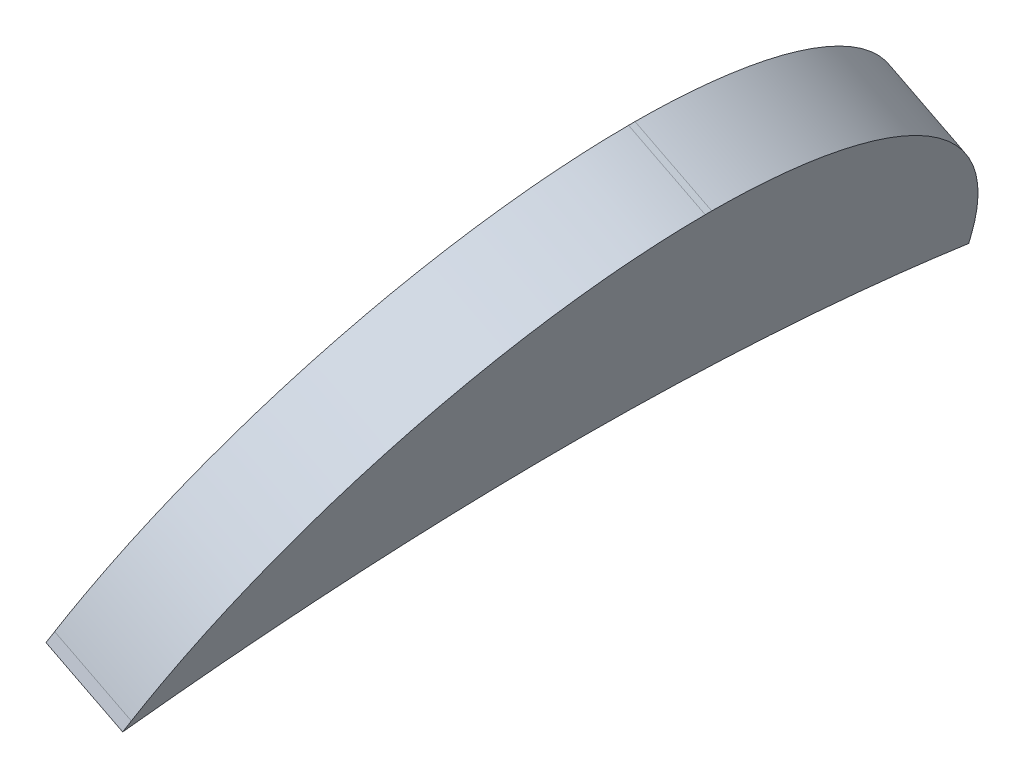
ISO-10303-21;
HEADER;
FILE_DESCRIPTION(('STEP AP214'),'2;1');
FILE_NAME('part.step','',(''),(''),'','','');
FILE_SCHEMA(('AUTOMOTIVE_DESIGN { 1 0 10303 214 1 1 1 1 }'));
ENDSEC;
DATA;
#1=APPLICATION_CONTEXT('core data for automotive mechanical design processes');
#2=APPLICATION_PROTOCOL_DEFINITION('international standard','automotive_design',2000,#1);
#3=PRODUCT_CONTEXT('',#1,'mechanical');
#4=PRODUCT('Part','Part','',(#3));
#5=PRODUCT_RELATED_PRODUCT_CATEGORY('part','',(#4));
#6=PRODUCT_DEFINITION_FORMATION('','',#4);
#7=PRODUCT_DEFINITION_CONTEXT('part definition',#1,'design');
#8=PRODUCT_DEFINITION('design','',#6,#7);
#9=PRODUCT_DEFINITION_SHAPE('','',#8);
#10=(LENGTH_UNIT() NAMED_UNIT(*) SI_UNIT(.MILLI.,.METRE.));
#11=(NAMED_UNIT(*) PLANE_ANGLE_UNIT() SI_UNIT($,.RADIAN.));
#12=(NAMED_UNIT(*) SI_UNIT($,.STERADIAN.) SOLID_ANGLE_UNIT());
#13=UNCERTAINTY_MEASURE_WITH_UNIT(LENGTH_MEASURE(1.E-05),#10,'distance_accuracy_value','');
#14=(GEOMETRIC_REPRESENTATION_CONTEXT(3) GLOBAL_UNCERTAINTY_ASSIGNED_CONTEXT((#13)) GLOBAL_UNIT_ASSIGNED_CONTEXT((#10,
#11,#12)) REPRESENTATION_CONTEXT('',''));
#15=CARTESIAN_POINT('',(0.,0.,0.));
#16=DIRECTION('',(0.,0.,1.));
#17=DIRECTION('',(1.,0.,0.));
#18=AXIS2_PLACEMENT_3D('',#15,#16,#17);
#19=CARTESIAN_POINT('',(35.2490884192573,12.9103957627904,-9.7549712300063));
#20=CARTESIAN_POINT('',(35.6192108039737,13.6368018433572,-9.5305018694734));
#21=CARTESIAN_POINT('',(35.968515207691,14.3223503357121,-9.19999755040302));
#22=CARTESIAN_POINT('',(36.3240511950212,15.0201289995315,-8.86359704085593));
#23=CARTESIAN_POINT('',(36.6500430439071,15.6599240268638,-8.42450539766577));
#24=CARTESIAN_POINT('',(36.9802362693852,16.3079647200339,-7.97975474993949));
#25=CARTESIAN_POINT('',(37.2722134976287,16.8810022955527,-7.43975909790062));
#26=CARTESIAN_POINT('',(37.5696349216576,17.4647247069142,-6.88969470841019));
#27=CARTESIAN_POINT('',(37.8199763918945,17.9560475063647,-6.25391612182486));
#28=CARTESIAN_POINT('',(38.0737529021154,18.4541119513747,-5.60941375142613));
#29=CARTESIAN_POINT('',(38.2725574032638,18.8442877538702,-4.89279397868525));
#30=CARTESIAN_POINT('',(38.4750773397058,19.2417555087055,-4.16278137841586));
#31=CARTESIAN_POINT('',(38.6150354312108,19.5164387294235,-3.37681221377558));
#32=CARTESIAN_POINT('',(38.7557841559375,19.7926736552085,-2.58640305337568));
#33=CARTESIAN_POINT('',(38.8292609954785,19.936880072403,-1.76032012357194));
#34=CARTESIAN_POINT('',(38.9036011901101,20.0827809193683,-0.924530694316677));
#35=CARTESIAN_POINT('',(38.9067912024292,20.0890416710583,-0.0755121780838611));
#36=B_SPLINE_CURVE_WITH_KNOTS('',2,(#19,#20,#21,#22,#23,#24,#25,#26,#27,#28,#29,#30,#31,#32,#33,
#34,#35),.UNSPECIFIED.,.F.,.F.,(3,2,2,2,2,2,2,2,3),(0.,0.125,0.25,0.375,0.5,0.625,0.75,0.875,
1.),.UNSPECIFIED.);
#37=DIRECTION('',(0.891006524188365,-0.453990499739552,0.));
#38=VECTOR('',#37,1.);
#39=SURFACE_OF_LINEAR_EXTRUSION('',#36,#38);
#40=CARTESIAN_POINT('',(54.0564950248638,3.32754345824409,-9.75497123000664));
#41=CARTESIAN_POINT('',(54.113171539568,3.43877738141789,-9.72059922411126));
#42=CARTESIAN_POINT('',(54.1696021043751,3.54952860073974,-9.68428725544756));
#43=CARTESIAN_POINT('',(54.2819177822345,3.76996053003947,-9.6077751760437));
#44=CARTESIAN_POINT('',(54.3378028902302,3.87964123009328,-9.56757502929647));
#45=CARTESIAN_POINT('',(54.5046491742697,4.2070954999536,-9.4410619710578));
#46=CARTESIAN_POINT('',(54.6147083005214,4.423098697362,-9.34889270930641));
#47=CARTESIAN_POINT('',(54.8319535294718,4.8494664659708,-9.14920445576849));
#48=CARTESIAN_POINT('',(54.9391386929741,5.05982919389474,-9.04168051705134));
#49=CARTESIAN_POINT('',(55.1505691576477,5.47478484504697,-8.81080109391559));
#50=CARTESIAN_POINT('',(55.2547983123668,5.67934607907867,-8.6873737214906));
#51=CARTESIAN_POINT('',(55.4592497178855,6.08060455541496,-8.42550347894755));
#52=CARTESIAN_POINT('',(55.559473237772,6.27730428844296,-8.28706541704522));
#53=CARTESIAN_POINT('',(55.7553530003226,6.66173996824062,-7.99537684574409));
#54=CARTESIAN_POINT('',(55.8510103824776,6.84947815138724,-7.8421300610758));
#55=CARTESIAN_POINT('',(56.0039898786009,7.1497173176057,-7.57852110438533));
#56=CARTESIAN_POINT('',(56.0628138250735,7.26516581292804,-7.47236344155542));
#57=CARTESIAN_POINT('',(56.17820391954,7.49163162455931,-7.25426089740207));
#58=CARTESIAN_POINT('',(56.2347699937709,7.60264879609988,-7.14231582728172));
#59=CARTESIAN_POINT('',(56.4008148868774,7.92853024769625,-6.79790754003357));
#60=CARTESIAN_POINT('',(56.5066756113853,8.13629361773587,-6.55681076670275));
#61=CARTESIAN_POINT('',(56.6571101813456,8.43153808513108,-6.17974108802468));
#62=CARTESIAN_POINT('',(56.7058153115994,8.52712728543916,-6.05162364496533));
#63=CARTESIAN_POINT('',(56.8003376943235,8.71263790677901,-5.79031072908529));
#64=CARTESIAN_POINT('',(56.8461552039565,8.80255983252068,-5.65711571015807));
#65=CARTESIAN_POINT('',(56.9347233024221,8.97638451302189,-5.38592850207537));
#66=CARTESIAN_POINT('',(56.977474740615,9.06028893474473,-5.24793765730306));
#67=CARTESIAN_POINT('',(57.059815286491,9.22189135511013,-4.9673813606735));
#68=CARTESIAN_POINT('',(57.0994033420332,9.29958728880962,-4.82481440871994));
#69=CARTESIAN_POINT('',(57.1709271324837,9.43996063134129,-4.55191007556448));
#70=CARTESIAN_POINT('',(57.2032210032108,9.50334092129381,-4.42202750516254));
#71=CARTESIAN_POINT('',(57.2650789320465,9.62474394227561,-4.15912885531162));
#72=CARTESIAN_POINT('',(57.29464276552,9.68276623243366,-4.02611251913585));
#73=CARTESIAN_POINT('',(57.3509426752869,9.79326102680122,-3.75723709382679));
#74=CARTESIAN_POINT('',(57.3776792689517,9.84573454640917,-3.62137853027706));
#75=CARTESIAN_POINT('',(57.4282687911758,9.94502207419455,-3.3470784105811));
#76=CARTESIAN_POINT('',(57.4521216935917,9.99183603106281,-3.20863683103056));
#77=CARTESIAN_POINT('',(57.4968147500151,10.0795510931226,-2.92960011925847));
#78=CARTESIAN_POINT('',(57.5176585111688,10.1204592777371,-2.78900779270161));
#79=CARTESIAN_POINT('',(57.5562831369796,10.1962643741245,-2.50581399646791));
#80=CARTESIAN_POINT('',(57.5740643586675,10.23116198661,-2.36321276308915));
#81=CARTESIAN_POINT('',(57.6065046657975,10.2948296741851,-2.07637377664296));
#82=CARTESIAN_POINT('',(57.6211653635472,10.3236029136066,-1.93213690944804));
#83=CARTESIAN_POINT('',(57.6473478910575,10.3749890171591,-1.64229529294415));
#84=CARTESIAN_POINT('',(57.6588697086321,10.3976018573736,-1.49669053832689));
#85=CARTESIAN_POINT('',(57.683113673492,10.4451833175027,-1.13937774720138));
#86=CARTESIAN_POINT('',(57.6940900173651,10.4667256053001,-0.927075509946327));
#87=CARTESIAN_POINT('',(57.7054455272007,10.4890120481987,-0.607979798457037));
#88=CARTESIAN_POINT('',(57.7083788831611,10.4947690834231,-0.501593783152101));
#89=CARTESIAN_POINT('',(57.7125551969867,10.5029655608115,-0.28865115558959));
#90=CARTESIAN_POINT('',(57.7137980018287,10.5054047026506,-0.182094528762694));
#91=CARTESIAN_POINT('',(57.7141978080355,10.5061893665121,-0.0755121780841964));
#92=B_SPLINE_CURVE_WITH_KNOTS('',3,(#40,#41,#42,#43,#44,#45,#46,#47,#48,#49,#50,#51,#52,#53,#54,
#55,#56,#57,#58,#59,#60,#61,#62,#63,#64,#65,#66,#67,#68,#69,#70,#71,#72,#73,#74,#75,#76,#77,#78,
#79,#80,#81,#82,#83,#84,#85,#86,#87,#88,#89,#90,#91),.UNSPECIFIED.,.F.,.F.,(4,2,2,2,2,2,2,2,2,2,
2,2,2,2,2,2,2,2,2,2,2,2,2,2,2,4),(0.,0.388427147838391,0.776857893110456,1.55435559830047,
2.33210436323393,3.11350093590628,3.89464794738185,4.67559899150483,5.17794821526701,
5.68031383702904,6.68475097764644,7.18591367029899,7.68703166770575,8.18801030534154,
8.68915488086065,9.1332634737134,9.57740857656615,10.0214722618244,10.465539972628,
10.9090708658734,11.3525500172282,11.7957994732294,12.2390506500366,12.8794674228852,
13.199159228906,13.518879970467),.UNSPECIFIED.);
#93=CARTESIAN_POINT('',(54.0564950248638,3.32754345824409,-9.75497123000664));
#94=VERTEX_POINT('',#93);
#95=CARTESIAN_POINT('',(57.7141978080355,10.5061893665121,-0.0755121780841964));
#96=VERTEX_POINT('',#95);
#97=EDGE_CURVE('E218',#94,#96,#92,.T.);
#98=ORIENTED_EDGE('',*,*,#97,.T.);
#99=DIRECTION('',(0.891006524188365,-0.453990499739552,0.));
#100=VECTOR('',#99,1.);
#101=CARTESIAN_POINT('',(58.6052043322236,10.0521988667722,-0.0755121780842122));
#102=LINE('',#101,#100);
#103=CARTESIAN_POINT('',(59.4962108564122,9.59820836703303,-0.0755121780842281));
#104=VERTEX_POINT('',#103);
#105=EDGE_CURVE('E11',#104,#96,#102,.F.);
#106=ORIENTED_EDGE('',*,*,#105,.F.);
#107=CARTESIAN_POINT('',(55.8385080732406,2.41956245876498,-9.75497123000667));
#108=CARTESIAN_POINT('',(55.8951845879448,2.53079638193878,-9.72059922411129));
#109=CARTESIAN_POINT('',(55.9516151527518,2.64154760126064,-9.68428725544759));
#110=CARTESIAN_POINT('',(56.0639308306112,2.86197953056037,-9.60777517604373));
#111=CARTESIAN_POINT('',(56.119815938607,2.97166023061418,-9.5675750292965));
#112=CARTESIAN_POINT('',(56.2866622226464,3.2991145004745,-9.44106197105784));
#113=CARTESIAN_POINT('',(56.3967213488981,3.5151176978829,-9.34889270930644));
#114=CARTESIAN_POINT('',(56.6139665778485,3.9414854664917,-9.14920445576852));
#115=CARTESIAN_POINT('',(56.7211517413508,4.15184819441564,-9.04168051705137));
#116=CARTESIAN_POINT('',(56.9325822060244,4.56680384556786,-8.81080109391562));
#117=CARTESIAN_POINT('',(57.0368113607435,4.77136507959957,-8.68737372149063));
#118=CARTESIAN_POINT('',(57.2412627662622,5.17262355593586,-8.42550347894758));
#119=CARTESIAN_POINT('',(57.3414862861487,5.36932328896386,-8.28706541704525));
#120=CARTESIAN_POINT('',(57.5373660486993,5.75375896876151,-7.99537684574412));
#121=CARTESIAN_POINT('',(57.6330234308544,5.94149715190814,-7.84213006107582));
#122=CARTESIAN_POINT('',(57.7860029269777,6.24173631812659,-7.57852110438536));
#123=CARTESIAN_POINT('',(57.8448268734502,6.35718481344894,-7.47236344155545));
#124=CARTESIAN_POINT('',(57.9602169679168,6.5836506250802,-7.25426089740211));
#125=CARTESIAN_POINT('',(58.0167830421476,6.69466779662077,-7.14231582728175));
#126=CARTESIAN_POINT('',(58.1828279352541,7.02054924821714,-6.7979075400336));
#127=CARTESIAN_POINT('',(58.288688659762,7.22831261825676,-6.55681076670278));
#128=CARTESIAN_POINT('',(58.4391232297223,7.52355708565198,-6.17974108802472));
#129=CARTESIAN_POINT('',(58.4878283599761,7.61914628596005,-6.05162364496537));
#130=CARTESIAN_POINT('',(58.5823507427003,7.8046569072999,-5.79031072908534));
#131=CARTESIAN_POINT('',(58.6281682523332,7.89457883304157,-5.65711571015811));
#132=CARTESIAN_POINT('',(58.7167363507988,8.06840351354278,-5.38592850207541));
#133=CARTESIAN_POINT('',(58.7594877889917,8.15230793526562,-5.24793765730311));
#134=CARTESIAN_POINT('',(58.8418283348678,8.31391035563101,-4.96738136067354));
#135=CARTESIAN_POINT('',(58.8814163904099,8.39160628933051,-4.82481440871999));
#136=CARTESIAN_POINT('',(58.9529401808604,8.53197963186218,-4.55191007556453));
#137=CARTESIAN_POINT('',(58.9852340515875,8.5953599218147,-4.42202750516259));
#138=CARTESIAN_POINT('',(59.0470919804233,8.7167629427965,-4.15912885531167));
#139=CARTESIAN_POINT('',(59.0766558138967,8.77478523295455,-4.02611251913591));
#140=CARTESIAN_POINT('',(59.1329557236637,8.88528002732211,-3.75723709382685));
#141=CARTESIAN_POINT('',(59.1596923173285,8.93775354693006,-3.62137853027712));
#142=CARTESIAN_POINT('',(59.2102818395525,9.03704107471543,-3.34707841058115));
#143=CARTESIAN_POINT('',(59.2341347419684,9.08385503158369,-3.20863683103062));
#144=CARTESIAN_POINT('',(59.2788277983918,9.17157009364347,-2.92960011925853));
#145=CARTESIAN_POINT('',(59.2996715595456,9.212478278258,-2.78900779270167));
#146=CARTESIAN_POINT('',(59.3382961853563,9.28828337464538,-2.50581399646797));
#147=CARTESIAN_POINT('',(59.3560774070442,9.32318098713085,-2.36321276308922));
#148=CARTESIAN_POINT('',(59.3885177141743,9.38684867470603,-2.07637377664302));
#149=CARTESIAN_POINT('',(59.4031784119239,9.4156219141275,-1.9321369094481));
#150=CARTESIAN_POINT('',(59.4293609394343,9.46700801768,-1.64229529294421));
#151=CARTESIAN_POINT('',(59.4408827570089,9.48962085789447,-1.49669053832696));
#152=CARTESIAN_POINT('',(59.4651267218688,9.53720231802359,-1.13937774720145));
#153=CARTESIAN_POINT('',(59.4761030657419,9.558744605821,-0.927075509946384));
#154=CARTESIAN_POINT('',(59.4874585755774,9.58103104871961,-0.607979798457085));
#155=CARTESIAN_POINT('',(59.4903919315379,9.58678808394395,-0.501593783152147));
#156=CARTESIAN_POINT('',(59.4945682453635,9.59498456133235,-0.288651155589629));
#157=CARTESIAN_POINT('',(59.4958110502054,9.59742370317145,-0.182094528762729));
#158=CARTESIAN_POINT('',(59.4962108564122,9.59820836703303,-0.0755121780842281));
#159=B_SPLINE_CURVE_WITH_KNOTS('',3,(#107,#108,#109,#110,#111,#112,#113,#114,#115,#116,#117,
#118,#119,#120,#121,#122,#123,#124,#125,#126,#127,#128,#129,#130,#131,#132,#133,#134,#135,#136,
#137,#138,#139,#140,#141,#142,#143,#144,#145,#146,#147,#148,#149,#150,#151,#152,#153,#154,#155,
#156,#157,#158),.UNSPECIFIED.,.F.,.F.,(4,2,2,2,2,2,2,2,2,2,2,2,2,2,2,2,2,2,2,2,2,2,2,2,2,4),(0.,
0.388427147838392,0.776857893110461,1.55435559830048,2.33210436323393,3.11350093590628,
3.89464794738185,4.67559899150483,5.17794821526701,5.68031383702903,6.68475097764643,
7.18591367029898,7.68703166770574,8.18801030534153,8.68915488086064,9.13326347371338,
9.57740857656613,10.0214722618244,10.4655399726279,10.9090708658734,11.3525500172281,
11.7957994732293,12.2390506500365,12.8794674228851,13.199159228906,13.518879970467),.UNSPECIFIED.);
#160=CARTESIAN_POINT('',(55.8385080732406,2.41956245876498,-9.75497123000667));
#161=VERTEX_POINT('',#160);
#162=EDGE_CURVE('E205',#161,#104,#159,.T.);
#163=ORIENTED_EDGE('',*,*,#162,.F.);
#164=DIRECTION('',(0.891006524188365,-0.453990499739552,0.));
#165=VECTOR('',#164,1.);
#166=CARTESIAN_POINT('',(54.9475015490522,2.87355295850454,-9.75497123000665));
#167=LINE('',#166,#165);
#168=EDGE_CURVE('E212',#161,#94,#167,.F.);
#169=ORIENTED_EDGE('',*,*,#168,.T.);
#170=EDGE_LOOP('',(#98,#106,#163,#169));
#171=FACE_BOUND('',#170,.T.);
#172=ADVANCED_FACE('F42',(#171),#39,.T.);
#173=CARTESIAN_POINT('',(59.4962108564124,9.59820836703334,0.0755121780439684));
#174=DIRECTION('',(-0.453990499739548,-0.891006524188367,-7.39999391529568E-13));
#175=DIRECTION('',(0.891006524188367,-0.453990499739548,0.));
#176=AXIS2_PLACEMENT_3D('',#173,#174,#175);
#177=PLANE('',#176);
#178=DIRECTION('',(-3.67564230415252E-13,-6.43237403226691E-13,1.));
#179=VECTOR('',#178,1.);
#180=CARTESIAN_POINT('',(57.7141978080356,10.5061893665124,0.0755121780439684));
#181=LINE('',#180,#179);
#182=CARTESIAN_POINT('',(57.7141978080356,10.5061893665124,0.0755121780439684));
#183=VERTEX_POINT('',#182);
#184=EDGE_CURVE('E228',#96,#183,#181,.T.);
#185=ORIENTED_EDGE('',*,*,#184,.T.);
#186=DIRECTION('',(0.891006524188365,-0.453990499739552,0.));
#187=VECTOR('',#186,1.);
#188=CARTESIAN_POINT('',(58.605204332224,10.0521988667729,0.0755121780439525));
#189=LINE('',#188,#187);
#190=CARTESIAN_POINT('',(59.4962108564123,9.59820836703333,0.0755121780439366));
#191=VERTEX_POINT('',#190);
#192=EDGE_CURVE('E53',#191,#183,#189,.F.);
#193=ORIENTED_EDGE('',*,*,#192,.F.);
#194=DIRECTION('',(-3.67564230415252E-13,-6.43237403226691E-13,1.));
#195=VECTOR('',#194,1.);
#196=CARTESIAN_POINT('',(59.4962108564124,9.59820836703334,0.0755121780439684));
#197=LINE('',#196,#195);
#198=EDGE_CURVE('E74',#104,#191,#197,.T.);
#199=ORIENTED_EDGE('',*,*,#198,.F.);
#200=ORIENTED_EDGE('',*,*,#105,.T.);
#201=EDGE_LOOP('',(#185,#193,#199,#200));
#202=FACE_BOUND('',#201,.T.);
#203=ADVANCED_FACE('F170',(#202),#177,.F.);
#204=CARTESIAN_POINT('',(38.9067912024293,20.0890416710586,0.0755121780443037));
#205=CARTESIAN_POINT('',(38.9036192115726,20.0828162884799,0.919734300937986));
#206=CARTESIAN_POINT('',(38.8299997944435,19.9383300470131,1.75199111754715));
#207=CARTESIAN_POINT('',(38.7564282155278,19.7939376933265,2.58370713010286));
#208=CARTESIAN_POINT('',(38.6142343024536,19.5148664257082,3.38130855209937));
#209=CARTESIAN_POINT('',(38.4753811225035,19.2423517160153,4.16017096176636));
#210=CARTESIAN_POINT('',(38.2744755688813,18.8480523658621,4.88587247973147));
#211=CARTESIAN_POINT('',(38.0751348200923,18.4568241181135,5.60592168384942));
#212=CARTESIAN_POINT('',(37.8196088339715,17.9553261333231,6.25484957597894));
#213=CARTESIAN_POINT('',(37.3225581169416,16.9798091743113,7.51714809590748));
#214=CARTESIAN_POINT('',(36.6529735774407,15.6656755227631,8.42055482266221));
#215=CARTESIAN_POINT('',(36.0026747028792,14.3893921198305,9.29794123621033));
#216=CARTESIAN_POINT('',(35.2490884192576,12.9103957627902,9.75497123000699));
#217=B_SPLINE_CURVE_WITH_KNOTS('',2,(#204,#205,#206,#207,#208,#209,#210,#211,#212,#213,#214,
#215,#216),.UNSPECIFIED.,.F.,.F.,(3,2,2,2,2,2,3),(0.,0.125,0.25,0.375,0.5,0.75,1.),.UNSPECIFIED.);
#218=DIRECTION('',(0.891006524188365,-0.453990499739552,0.));
#219=VECTOR('',#218,1.);
#220=SURFACE_OF_LINEAR_EXTRUSION('',#217,#219);
#221=CARTESIAN_POINT('',(57.7141978080356,10.5061893665124,0.0755121780439684));
#222=CARTESIAN_POINT('',(57.7137056519681,10.5052234558439,0.207414793511595));
#223=CARTESIAN_POINT('',(57.7119162154395,10.501711488914,0.339293128886856));
#224=CARTESIAN_POINT('',(57.7057455908609,10.4896009562904,0.602750121327787));
#225=CARTESIAN_POINT('',(57.7013645029979,10.4810025872252,0.734328789780503));
#226=CARTESIAN_POINT('',(57.6900148748831,10.4587276878533,0.996910209753328));
#227=CARTESIAN_POINT('',(57.6830470316434,10.4450525255105,1.12791310680473));
#228=CARTESIAN_POINT('',(57.6665520689436,10.4126793384279,1.38912589748981));
#229=CARTESIAN_POINT('',(57.6570249195524,10.3939812549453,1.51933578183101));
#230=CARTESIAN_POINT('',(57.6247397113713,10.3306179661966,1.90760852707728));
#231=CARTESIAN_POINT('',(57.5982385452672,10.2786064991925,2.16421425048234));
#232=CARTESIAN_POINT('',(57.5354290288163,10.1553358823603,2.67149805237717));
#233=CARTESIAN_POINT('',(57.4991202743034,10.0840759393115,2.92217588611828));
#234=CARTESIAN_POINT('',(57.4172211543711,9.92333986614056,3.41587370062559));
#235=CARTESIAN_POINT('',(57.3716369388627,9.83387580589868,3.65889863284413));
#236=CARTESIAN_POINT('',(57.2715679834817,9.63747942279296,4.13587200501085));
#237=CARTESIAN_POINT('',(57.2170834064128,9.53054741944958,4.36982061088469));
#238=CARTESIAN_POINT('',(57.0998023339911,9.30037035461766,4.82741143836911));
#239=CARTESIAN_POINT('',(57.0370043395819,9.17712235106557,5.05105179139092));
#240=CARTESIAN_POINT('',(56.9036320293902,8.91536445393979,5.48682721981157));
#241=CARTESIAN_POINT('',(56.8330572173154,8.77685358633779,5.69896155964198));
#242=CARTESIAN_POINT('',(56.7200287057269,8.55502264207267,6.01270928873766));
#243=CARTESIAN_POINT('',(56.6801642915292,8.47678432397242,6.11890265878426));
#244=CARTESIAN_POINT('',(56.5985799203972,8.3166659801037,6.32778375411513));
#245=CARTESIAN_POINT('',(56.5568599320403,8.23478589266492,6.43047141998114));
#246=CARTESIAN_POINT('',(56.4716503630498,8.06755269739452,6.6322143075975));
#247=CARTESIAN_POINT('',(56.4281608465897,7.98219971551053,6.73126966082969));
#248=CARTESIAN_POINT('',(56.339476972163,7.80814781189183,6.92558939019138));
#249=CARTESIAN_POINT('',(56.2942826328846,7.71944892683462,7.02085380785329));
#250=CARTESIAN_POINT('',(56.1561254568633,7.44830020176433,7.30103994005702));
#251=CARTESIAN_POINT('',(56.0606866600148,7.26099101643664,7.480122184798));
#252=CARTESIAN_POINT('',(55.9131799195169,6.97149273790265,7.73645780879292));
#253=CARTESIAN_POINT('',(55.8632794256678,6.87355750444449,7.81986518199033));
#254=CARTESIAN_POINT('',(55.7621114092642,6.67500409262962,7.98257705134471));
#255=CARTESIAN_POINT('',(55.7108438492029,6.5743858406618,8.06188143475646));
#256=CARTESIAN_POINT('',(55.5977564106116,6.35243924564175,8.23018387612455));
#257=CARTESIAN_POINT('',(55.5356897692081,6.23062660318187,8.31837745663544));
#258=CARTESIAN_POINT('',(55.4099570896398,5.98386232537575,8.48905279908435));
#259=CARTESIAN_POINT('',(55.3462909975259,5.85891058414853,8.57153436800423));
#260=CARTESIAN_POINT('',(55.2174468156096,5.60603963914647,8.73063118261367));
#261=CARTESIAN_POINT('',(55.1522684305618,5.47811985591977,8.80724527002071));
#262=CARTESIAN_POINT('',(55.020535025463,5.21957849114689,8.95445623451084));
#263=CARTESIAN_POINT('',(54.9539800409618,5.0889569793711,9.02505326673999));
#264=CARTESIAN_POINT('',(54.7527359928945,4.69399329646383,9.22736328909174));
#265=CARTESIAN_POINT('',(54.6161312290627,4.42589135186545,9.35001035714656));
#266=CARTESIAN_POINT('',(54.4082928082239,4.01798548367954,9.51556833077547));
#267=CARTESIAN_POINT('',(54.3385303175634,3.88106888661901,9.56768221980284));
#268=CARTESIAN_POINT('',(54.1981378246879,3.60553310520766,9.66585040821826));
#269=CARTESIAN_POINT('',(54.127507892975,3.46691405922474,9.71190519654753));
#270=CARTESIAN_POINT('',(54.056495024864,3.32754345824401,9.75497123000665));
#271=B_SPLINE_CURVE_WITH_KNOTS('',3,(#221,#222,#223,#224,#225,#226,#227,#228,#229,#230,#231,
#232,#233,#234,#235,#236,#237,#238,#239,#240,#241,#242,#243,#244,#245,#246,#247,#248,#249,#250,
#251,#252,#253,#254,#255,#256,#257,#258,#259,#260,#261,#262,#263,#264,#265,#266,#267,#268,#269,
#270),.UNSPECIFIED.,.F.,.F.,(4,2,2,2,2,2,2,2,2,2,2,2,2,2,2,2,2,2,2,2,2,2,2,2,4),(0.,
0.395688628320893,0.79136196125125,1.18692875559278,1.58250017628095,2.37094001501205,
3.15941234993856,3.94736359742558,4.73530043346441,5.52337954247553,6.31150897339272,
6.72480422019349,7.13810646847024,7.55139374130496,7.9646764850352,8.7921918722705,
9.20605802684327,9.61993554792655,10.1078673291391,10.5958155903202,11.0838599289845,
11.571891679917,12.5454133874925,13.032098692627,13.518744700402),.UNSPECIFIED.);
#272=CARTESIAN_POINT('',(54.0564950248638,3.32754345824409,9.75497123000665));
#273=VERTEX_POINT('',#272);
#274=EDGE_CURVE('E109',#183,#273,#271,.T.);
#275=ORIENTED_EDGE('',*,*,#274,.T.);
#276=DIRECTION('',(0.891006524188365,-0.453990499739552,0.));
#277=VECTOR('',#276,1.);
#278=CARTESIAN_POINT('',(54.9475015490522,2.87355295850454,9.75497123000662));
#279=LINE('',#278,#277);
#280=CARTESIAN_POINT('',(55.8385080732406,2.41956245876499,9.75497123000662));
#281=VERTEX_POINT('',#280);
#282=EDGE_CURVE('E141',#281,#273,#279,.F.);
#283=ORIENTED_EDGE('',*,*,#282,.F.);
#284=CARTESIAN_POINT('',(59.4962108564123,9.59820836703333,0.0755121780439366));
#285=CARTESIAN_POINT('',(59.4957187003448,9.5972424563648,0.207414793511563));
#286=CARTESIAN_POINT('',(59.4939292638162,9.59373048943485,0.339293128886824));
#287=CARTESIAN_POINT('',(59.4877586392376,9.58161995681131,0.602750121327755));
#288=CARTESIAN_POINT('',(59.4833775513747,9.57302158774604,0.73432878978047));
#289=CARTESIAN_POINT('',(59.4720279232598,9.55074668837418,0.996910209753295));
#290=CARTESIAN_POINT('',(59.4650600800202,9.53707152603138,1.12791310680469));
#291=CARTESIAN_POINT('',(59.4485651173204,9.50469833894885,1.38912589748977));
#292=CARTESIAN_POINT('',(59.4390379679292,9.48600025546616,1.51933578183098));
#293=CARTESIAN_POINT('',(59.4067527597481,9.42263696671747,1.90760852707725));
#294=CARTESIAN_POINT('',(59.3802515936439,9.37062549971342,2.16421425048231));
#295=CARTESIAN_POINT('',(59.3174420771931,9.24735488288121,2.67149805237714));
#296=CARTESIAN_POINT('',(59.2811333226802,9.17609493983236,2.92217588611825));
#297=CARTESIAN_POINT('',(59.1992342027478,9.01535886666146,3.41587370062555));
#298=CARTESIAN_POINT('',(59.1536499872395,8.92589480641958,3.6588986328441));
#299=CARTESIAN_POINT('',(59.0535810318584,8.72949842331386,4.13587200501082));
#300=CARTESIAN_POINT('',(58.9990964547896,8.62256641997048,4.36982061088467));
#301=CARTESIAN_POINT('',(58.8818153823678,8.39238935513856,4.82741143836908));
#302=CARTESIAN_POINT('',(58.8190173879586,8.26914135158646,5.05105179139089));
#303=CARTESIAN_POINT('',(58.6856450777669,8.00738345446068,5.48682721981154));
#304=CARTESIAN_POINT('',(58.6150702656921,7.86887258685868,5.69896155964194));
#305=CARTESIAN_POINT('',(58.5020417541037,7.64704164259356,6.01270928873763));
#306=CARTESIAN_POINT('',(58.462177339906,7.56880332449331,6.11890265878424));
#307=CARTESIAN_POINT('',(58.3805929687739,7.4086849806246,6.32778375411511));
#308=CARTESIAN_POINT('',(58.3388729804171,7.32680489318582,6.43047141998111));
#309=CARTESIAN_POINT('',(58.2536634114265,7.15957169791541,6.63221430759747));
#310=CARTESIAN_POINT('',(58.2101738949664,7.07421871603142,6.73126966082966));
#311=CARTESIAN_POINT('',(58.1214900205397,6.90016681241271,6.92558939019135));
#312=CARTESIAN_POINT('',(58.0762956812613,6.8114679273555,7.02085380785326));
#313=CARTESIAN_POINT('',(57.93813850524,6.54031920228522,7.30103994005699));
#314=CARTESIAN_POINT('',(57.8426997083915,6.35301001695753,7.48012218479798));
#315=CARTESIAN_POINT('',(57.6951929678936,6.06351173842353,7.7364578087929));
#316=CARTESIAN_POINT('',(57.6452924740445,5.96557650496536,7.81986518199031));
#317=CARTESIAN_POINT('',(57.5441244576409,5.76702309315049,7.98257705134469));
#318=CARTESIAN_POINT('',(57.4928568975796,5.66640484118268,8.06188143475643));
#319=CARTESIAN_POINT('',(57.3797694589883,5.44445824616264,8.23018387612452));
#320=CARTESIAN_POINT('',(57.3177028175848,5.32264560370275,8.31837745663542));
#321=CARTESIAN_POINT('',(57.1919701380165,5.07588132589663,8.48905279908432));
#322=CARTESIAN_POINT('',(57.1283040459026,4.95092958466941,8.57153436800421));
#323=CARTESIAN_POINT('',(56.9994598639863,4.69805863966735,8.73063118261364));
#324=CARTESIAN_POINT('',(56.9342814789385,4.57013885644065,8.80724527002069));
#325=CARTESIAN_POINT('',(56.8025480738397,4.31159749166777,8.95445623451082));
#326=CARTESIAN_POINT('',(56.7359930893385,4.18097597989199,9.02505326673996));
#327=CARTESIAN_POINT('',(56.5347490412712,3.78601229698473,9.22736328909171));
#328=CARTESIAN_POINT('',(56.3981442774394,3.51791035238634,9.35001035714653));
#329=CARTESIAN_POINT('',(56.1903058566006,3.11000448420043,9.51556833077544));
#330=CARTESIAN_POINT('',(56.1205433659401,2.97308788713991,9.56768221980281));
#331=CARTESIAN_POINT('',(55.9801508730647,2.69755210572856,9.66585040821822));
#332=CARTESIAN_POINT('',(55.9095209413517,2.55893305974564,9.7119051965475));
#333=CARTESIAN_POINT('',(55.8385080732407,2.4195624587649,9.75497123000662));
#334=B_SPLINE_CURVE_WITH_KNOTS('',3,(#284,#285,#286,#287,#288,#289,#290,#291,#292,#293,#294,
#295,#296,#297,#298,#299,#300,#301,#302,#303,#304,#305,#306,#307,#308,#309,#310,#311,#312,#313,
#314,#315,#316,#317,#318,#319,#320,#321,#322,#323,#324,#325,#326,#327,#328,#329,#330,#331,#332,
#333),.UNSPECIFIED.,.F.,.F.,(4,2,2,2,2,2,2,2,2,2,2,2,2,2,2,2,2,2,2,2,2,2,2,2,4),(0.,
0.395688628320893,0.791361961251249,1.18692875559278,1.58250017628095,2.37094001501205,
3.15941234993856,3.94736359742558,4.73530043346442,5.52337954247553,6.31150897339272,
6.7248042201935,7.13810646847025,7.55139374130497,7.96467648503521,8.79219187227052,
9.20605802684329,9.61993554792658,10.1078673291391,10.5958155903202,11.0838599289845,
11.571891679917,12.5454133874925,13.032098692627,13.518744700402),.UNSPECIFIED.);
#335=EDGE_CURVE('E133',#191,#281,#334,.T.);
#336=ORIENTED_EDGE('',*,*,#335,.F.);
#337=ORIENTED_EDGE('',*,*,#192,.T.);
#338=EDGE_LOOP('',(#275,#283,#336,#337));
#339=FACE_BOUND('',#338,.T.);
#340=ADVANCED_FACE('F169',(#339),#220,.T.);
#341=CARTESIAN_POINT('',(55.8385080732406,2.41956245876499,9.75497123000665));
#342=DIRECTION('',(-0.120514081399415,-0.236522202215795,-0.964123230735286));
#343=DIRECTION('',(0.,0.971201720030234,-0.238258722842027));
#344=AXIS2_PLACEMENT_3D('',#341,#342,#343);
#345=PLANE('',#344);
#346=DIRECTION('',(-0.437702787332023,-0.859040088706705,0.265455073329846));
#347=VECTOR('',#346,1.);
#348=CARTESIAN_POINT('',(54.0564950248638,3.32754345824409,9.75497123000665));
#349=LINE('',#348,#347);
#350=CARTESIAN_POINT('',(53.9310758568799,3.08139448156707,9.83103461227818));
#351=VERTEX_POINT('',#350);
#352=EDGE_CURVE('E116',#273,#351,#349,.T.);
#353=ORIENTED_EDGE('',*,*,#352,.T.);
#354=DIRECTION('',(-0.891006524188367,0.453990499739548,0.));
#355=VECTOR('',#354,1.);
#356=CARTESIAN_POINT('',(55.7130889052566,2.17341348208797,9.83103461227818));
#357=LINE('',#356,#355);
#358=CARTESIAN_POINT('',(55.7130889052566,2.17341348208797,9.83103461227818));
#359=VERTEX_POINT('',#358);
#360=EDGE_CURVE('E136',#359,#351,#357,.T.);
#361=ORIENTED_EDGE('',*,*,#360,.F.);
#362=DIRECTION('',(-0.437702787332023,-0.859040088706705,0.265455073329846));
#363=VECTOR('',#362,1.);
#364=CARTESIAN_POINT('',(55.8385080732406,2.41956245876499,9.75497123000665));
#365=LINE('',#364,#363);
#366=EDGE_CURVE('E127',#281,#359,#365,.T.);
#367=ORIENTED_EDGE('',*,*,#366,.F.);
#368=ORIENTED_EDGE('',*,*,#282,.T.);
#369=EDGE_LOOP('',(#353,#361,#367,#368));
#370=FACE_BOUND('',#369,.T.);
#371=ADVANCED_FACE('F137',(#370),#345,.F.);
#372=CARTESIAN_POINT('',(55.7130889052566,2.17341348208797,9.83103461227818));
#373=DIRECTION('',(0.436875681356243,0.85741680182948,0.271985416851757));
#374=DIRECTION('',(-0.891006524188367,0.453990499739548,0.));
#375=AXIS2_PLACEMENT_3D('',#372,#373,#374);
#376=PLANE('',#375);
#377=DIRECTION('',(0.123478795318414,0.242340780899,-0.962301373281768));
#378=VECTOR('',#377,1.);
#379=CARTESIAN_POINT('',(53.9310758568799,3.08139448156707,9.83103461227818));
#380=LINE('',#379,#378);
#381=CARTESIAN_POINT('',(53.9422482070508,3.10332145338375,9.74396567153765));
#382=VERTEX_POINT('',#381);
#383=EDGE_CURVE('E239',#351,#382,#380,.T.);
#384=ORIENTED_EDGE('',*,*,#383,.T.);
#385=DIRECTION('',(-0.891006524188367,0.453990499739548,0.));
#386=VECTOR('',#385,1.);
#387=CARTESIAN_POINT('',(55.7242612554276,2.19534045390466,9.74396567153765));
#388=LINE('',#387,#386);
#389=CARTESIAN_POINT('',(55.7242612554276,2.19534045390466,9.74396567153765));
#390=VERTEX_POINT('',#389);
#391=EDGE_CURVE('E142',#390,#382,#388,.T.);
#392=ORIENTED_EDGE('',*,*,#391,.F.);
#393=DIRECTION('',(0.123478795318414,0.242340780899,-0.962301373281768));
#394=VECTOR('',#393,1.);
#395=CARTESIAN_POINT('',(55.7130889052566,2.17341348208797,9.83103461227818));
#396=LINE('',#395,#394);
#397=EDGE_CURVE('E130',#359,#390,#396,.T.);
#398=ORIENTED_EDGE('',*,*,#397,.F.);
#399=ORIENTED_EDGE('',*,*,#360,.T.);
#400=EDGE_LOOP('',(#384,#392,#398,#399));
#401=FACE_BOUND('',#400,.T.);
#402=ADVANCED_FACE('F144',(#401),#376,.F.);
#403=CARTESIAN_POINT('',(36.0097402987446,-36.4965854866827,0.));
#404=DIRECTION('',(-0.891006524188367,0.453990499739548,0.));
#405=DIRECTION('',(-0.453990499739548,-0.891006524188367,0.));
#406=AXIS2_PLACEMENT_3D('',#403,#404,#405);
#407=ELLIPSE('',#406,44.780816881611,39.9);
#408=DIRECTION('',(-0.891006524188367,0.453990499739548,0.));
#409=VECTOR('',#408,1.);
#410=SURFACE_OF_LINEAR_EXTRUSION('',#407,#409);
#411=CARTESIAN_POINT('',(34.2277272503679,-35.5886044872036,0.));
#412=DIRECTION('',(-0.891006524188367,0.453990499739548,0.));
#413=DIRECTION('',(-0.453990499739548,-0.891006524188367,0.));
#414=AXIS2_PLACEMENT_3D('',#411,#412,#413);
#415=ELLIPSE('',#414,44.780816881611,39.9);
#416=CARTESIAN_POINT('',(53.9422485137392,3.10332205529358,-9.74396328143751));
#417=VERTEX_POINT('',#416);
#418=EDGE_CURVE('E242',#382,#417,#415,.T.);
#419=ORIENTED_EDGE('',*,*,#418,.T.);
#420=DIRECTION('',(-0.891006524188367,0.453990499739548,0.));
#421=VECTOR('',#420,1.);
#422=CARTESIAN_POINT('',(55.7242615621159,2.19534105581449,-9.74396328143751));
#423=LINE('',#422,#421);
#424=CARTESIAN_POINT('',(55.7242615621159,2.19534105581449,-9.74396328143751));
#425=VERTEX_POINT('',#424);
#426=EDGE_CURVE('E251',#425,#417,#423,.T.);
#427=ORIENTED_EDGE('',*,*,#426,.F.);
#428=EDGE_CURVE('E148',#390,#425,#407,.T.);
#429=ORIENTED_EDGE('',*,*,#428,.F.);
#430=ORIENTED_EDGE('',*,*,#391,.T.);
#431=EDGE_LOOP('',(#419,#427,#429,#430));
#432=FACE_BOUND('',#431,.T.);
#433=ADVANCED_FACE('F158',(#432),#410,.F.);
#434=CARTESIAN_POINT('',(55.7130889084169,2.17341348829028,-9.83103461036158));
#435=DIRECTION('',(0.436875689809553,0.857416818420036,-0.271985350972972));
#436=DIRECTION('',(-0.891006524188367,0.453990499739548,0.));
#437=AXIS2_PLACEMENT_3D('',#434,#435,#436);
#438=PLANE('',#437);
#439=DIRECTION('',(-0.123478765410065,-0.242340722200576,-0.962301391901783));
#440=VECTOR('',#439,1.);
#441=CARTESIAN_POINT('',(53.9310758600401,3.08139448776937,-9.83103461036158));
#442=LINE('',#441,#440);
#443=CARTESIAN_POINT('',(53.9310758600401,3.08139448776937,-9.83103461036158));
#444=VERTEX_POINT('',#443);
#445=EDGE_CURVE('E91',#417,#444,#442,.T.);
#446=ORIENTED_EDGE('',*,*,#445,.T.);
#447=DIRECTION('',(-0.891006524188367,0.453990499739548,0.));
#448=VECTOR('',#447,1.);
#449=CARTESIAN_POINT('',(55.7130889084169,2.17341348829028,-9.83103461036158));
#450=LINE('',#449,#448);
#451=CARTESIAN_POINT('',(55.7130889084169,2.17341348829028,-9.83103461036158));
#452=VERTEX_POINT('',#451);
#453=EDGE_CURVE('E214',#452,#444,#450,.T.);
#454=ORIENTED_EDGE('',*,*,#453,.F.);
#455=DIRECTION('',(-0.123478765410065,-0.242340722200576,-0.962301391901783));
#456=VECTOR('',#455,1.);
#457=CARTESIAN_POINT('',(55.7130889084169,2.17341348829028,-9.83103461036158));
#458=LINE('',#457,#456);
#459=EDGE_CURVE('E151',#425,#452,#458,.T.);
#460=ORIENTED_EDGE('',*,*,#459,.F.);
#461=ORIENTED_EDGE('',*,*,#426,.T.);
#462=EDGE_LOOP('',(#446,#454,#460,#461));
#463=FACE_BOUND('',#462,.T.);
#464=ADVANCED_FACE('F162',(#463),#438,.F.);
#465=CARTESIAN_POINT('',(55.8385080732405,2.41956245876487,-9.75497123000661));
#466=DIRECTION('',(-0.120514081399521,-0.236522202216002,0.964123230735222));
#467=DIRECTION('',(0.,-0.971201720030183,-0.238258722842239));
#468=AXIS2_PLACEMENT_3D('',#465,#466,#467);
#469=PLANE('',#468);
#470=DIRECTION('',(0.437702787331988,0.859040088706651,0.265455073330079));
#471=VECTOR('',#470,1.);
#472=CARTESIAN_POINT('',(54.0564950248638,3.32754345824397,-9.75497123000661));
#473=LINE('',#472,#471);
#474=EDGE_CURVE('E82',#444,#94,#473,.T.);
#475=ORIENTED_EDGE('',*,*,#474,.T.);
#476=ORIENTED_EDGE('',*,*,#168,.F.);
#477=DIRECTION('',(0.437702787331988,0.859040088706651,0.265455073330079));
#478=VECTOR('',#477,1.);
#479=CARTESIAN_POINT('',(55.8385080732405,2.41956245876487,-9.75497123000661));
#480=LINE('',#479,#478);
#481=EDGE_CURVE('E61',#452,#161,#480,.T.);
#482=ORIENTED_EDGE('',*,*,#481,.F.);
#483=ORIENTED_EDGE('',*,*,#453,.T.);
#484=EDGE_LOOP('',(#475,#476,#482,#483));
#485=FACE_BOUND('',#484,.T.);
#486=ADVANCED_FACE('F202',(#485),#469,.F.);
#487=CARTESIAN_POINT('',(58.4093960458777,7.4652142023394,-6.2539161218252));
#488=DIRECTION('',(0.891006524188374,-0.453990499739534,0.));
#489=DIRECTION('',(0.453990499739534,0.891006524188374,0.));
#490=AXIS2_PLACEMENT_3D('',#487,#488,#489);
#491=PLANE('',#490);
#492=ORIENTED_EDGE('',*,*,#162,.T.);
#493=ORIENTED_EDGE('',*,*,#198,.T.);
#494=ORIENTED_EDGE('',*,*,#335,.T.);
#495=ORIENTED_EDGE('',*,*,#366,.T.);
#496=ORIENTED_EDGE('',*,*,#397,.T.);
#497=ORIENTED_EDGE('',*,*,#428,.T.);
#498=ORIENTED_EDGE('',*,*,#459,.T.);
#499=ORIENTED_EDGE('',*,*,#481,.T.);
#500=EDGE_LOOP('',(#492,#493,#494,#495,#496,#497,#498,#499));
#501=FACE_BOUND('',#500,.T.);
#502=ADVANCED_FACE('F128',(#501),#491,.T.);
#503=CARTESIAN_POINT('',(56.6273829975009,8.3731952018185,-6.2539161218252));
#504=DIRECTION('',(0.891006524188374,-0.453990499739534,0.));
#505=DIRECTION('',(0.453990499739534,0.891006524188374,0.));
#506=AXIS2_PLACEMENT_3D('',#503,#504,#505);
#507=PLANE('',#506);
#508=ORIENTED_EDGE('',*,*,#97,.F.);
#509=ORIENTED_EDGE('',*,*,#474,.F.);
#510=ORIENTED_EDGE('',*,*,#445,.F.);
#511=ORIENTED_EDGE('',*,*,#418,.F.);
#512=ORIENTED_EDGE('',*,*,#383,.F.);
#513=ORIENTED_EDGE('',*,*,#352,.F.);
#514=ORIENTED_EDGE('',*,*,#274,.F.);
#515=ORIENTED_EDGE('',*,*,#184,.F.);
#516=EDGE_LOOP('',(#508,#509,#510,#511,#512,#513,#514,#515));
#517=FACE_BOUND('',#516,.T.);
#518=ADVANCED_FACE('F201',(#517),#507,.F.);
#519=CLOSED_SHELL('',(#172,#203,#340,#371,#402,#433,#464,#486,#502,#518));
#520=MANIFOLD_SOLID_BREP('B2',#519);
#521=ADVANCED_BREP_SHAPE_REPRESENTATION('',(#18,#520),#14);
#522=SHAPE_DEFINITION_REPRESENTATION(#9,#521);
ENDSEC;
END-ISO-10303-21;
